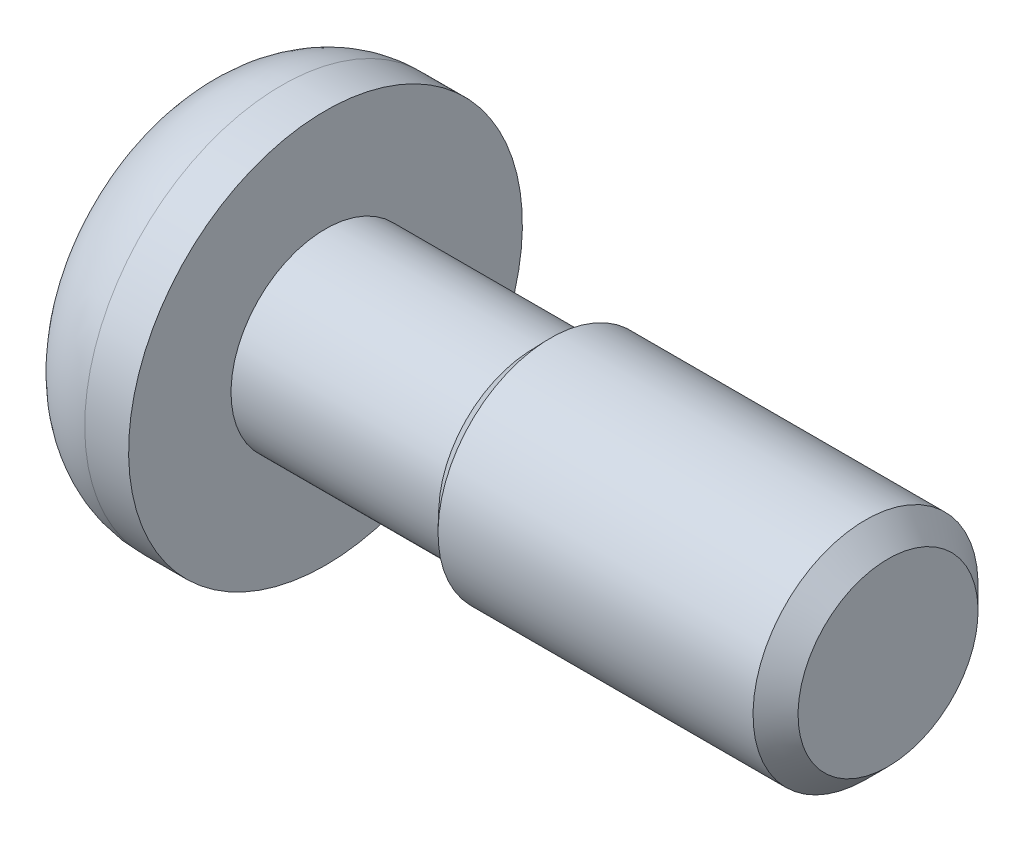
ISO-10303-21;
HEADER;
FILE_DESCRIPTION(('STEP AP214'),'2;1');
FILE_NAME('part.step','',(''),(''),'','','');
FILE_SCHEMA(('AUTOMOTIVE_DESIGN { 1 0 10303 214 1 1 1 1 }'));
ENDSEC;
DATA;
#1=APPLICATION_CONTEXT('core data for automotive mechanical design processes');
#2=APPLICATION_PROTOCOL_DEFINITION('international standard','automotive_design',2000,#1);
#3=PRODUCT_CONTEXT('',#1,'mechanical');
#4=PRODUCT('Part','Part','',(#3));
#5=PRODUCT_RELATED_PRODUCT_CATEGORY('part','',(#4));
#6=PRODUCT_DEFINITION_FORMATION('','',#4);
#7=PRODUCT_DEFINITION_CONTEXT('part definition',#1,'design');
#8=PRODUCT_DEFINITION('design','',#6,#7);
#9=PRODUCT_DEFINITION_SHAPE('','',#8);
#10=(LENGTH_UNIT() NAMED_UNIT(*) SI_UNIT(.MILLI.,.METRE.));
#11=(NAMED_UNIT(*) PLANE_ANGLE_UNIT() SI_UNIT($,.RADIAN.));
#12=(NAMED_UNIT(*) SI_UNIT($,.STERADIAN.) SOLID_ANGLE_UNIT());
#13=UNCERTAINTY_MEASURE_WITH_UNIT(LENGTH_MEASURE(1.E-05),#10,'distance_accuracy_value','');
#14=(GEOMETRIC_REPRESENTATION_CONTEXT(3) GLOBAL_UNCERTAINTY_ASSIGNED_CONTEXT((#13)) GLOBAL_UNIT_ASSIGNED_CONTEXT((#10,
#11,#12)) REPRESENTATION_CONTEXT('',''));
#15=CARTESIAN_POINT('',(0.,0.,0.));
#16=DIRECTION('',(0.,0.,1.));
#17=DIRECTION('',(1.,0.,0.));
#18=AXIS2_PLACEMENT_3D('',#15,#16,#17);
#19=CARTESIAN_POINT('',(-0.8,0.5275,0.325));
#20=DIRECTION('',(1.,0.,0.));
#21=DIRECTION('',(0.,0.,-1.));
#22=AXIS2_PLACEMENT_3D('',#19,#20,#21);
#23=PLANE('',#22);
#24=CARTESIAN_POINT('',(-0.8,0.175726349766277,-0.527499999999999));
#25=DIRECTION('',(0.,1.,0.));
#26=VECTOR('',#25,1.);
#27=LINE('',#24,#26);
#28=CARTESIAN_POINT('',(-0.8,0.175726349760073,-0.5275));
#29=VERTEX_POINT('',#28);
#30=CARTESIAN_POINT('',(-0.8,0.325,-0.5275));
#31=VERTEX_POINT('',#30);
#32=EDGE_CURVE('E480',#29,#31,#27,.T.);
#33=ORIENTED_EDGE('',*,*,#32,.F.);
#34=CARTESIAN_POINT('',(-0.8,0.,0.));
#35=DIRECTION('',(1.,0.,0.));
#36=DIRECTION('',(0.,0.,-1.));
#37=AXIS2_PLACEMENT_3D('',#34,#35,#36);
#38=CIRCLE('',#37,0.556);
#39=CARTESIAN_POINT('',(-0.8,0.325,-0.451121934736055));
#40=VERTEX_POINT('',#39);
#41=EDGE_CURVE('E617',#29,#40,#38,.T.);
#42=ORIENTED_EDGE('',*,*,#41,.T.);
#43=CARTESIAN_POINT('',(-0.8,0.324999999999998,-0.527500000000002));
#44=DIRECTION('',(0.,0.,1.));
#45=VECTOR('',#44,1.);
#46=LINE('',#43,#45);
#47=EDGE_CURVE('E454',#31,#40,#46,.T.);
#48=ORIENTED_EDGE('',*,*,#47,.F.);
#49=EDGE_LOOP('',(#33,#42,#48));
#50=FACE_BOUND('',#49,.T.);
#51=ADVANCED_FACE('F17',(#50),#23,.F.);
#52=CARTESIAN_POINT('',(-0.8,0.451121934736054,-0.325));
#53=DIRECTION('',(0.,1.,0.));
#54=VECTOR('',#53,1.);
#55=LINE('',#52,#54);
#56=CARTESIAN_POINT('',(-0.8,0.451121934736054,-0.325));
#57=VERTEX_POINT('',#56);
#58=CARTESIAN_POINT('',(-0.8,0.5275,-0.325));
#59=VERTEX_POINT('',#58);
#60=EDGE_CURVE('E260',#57,#59,#55,.T.);
#61=ORIENTED_EDGE('',*,*,#60,.F.);
#62=CARTESIAN_POINT('',(-0.8,0.527500000013099,-0.175726349720754));
#63=VERTEX_POINT('',#62);
#64=EDGE_CURVE('E610',#57,#63,#38,.T.);
#65=ORIENTED_EDGE('',*,*,#64,.T.);
#66=CARTESIAN_POINT('',(-0.8,0.5275,-0.325000000000001));
#67=DIRECTION('',(0.,0.,1.));
#68=VECTOR('',#67,1.);
#69=LINE('',#66,#68);
#70=EDGE_CURVE('E605',#59,#63,#69,.T.);
#71=ORIENTED_EDGE('',*,*,#70,.F.);
#72=EDGE_LOOP('',(#61,#65,#71));
#73=FACE_BOUND('',#72,.T.);
#74=ADVANCED_FACE('F174',(#73),#23,.F.);
#75=CARTESIAN_POINT('',(-0.8,0.5275,0.175726349760074));
#76=DIRECTION('',(0.,0.,1.));
#77=VECTOR('',#76,1.);
#78=LINE('',#75,#77);
#79=CARTESIAN_POINT('',(-0.8,0.5275,0.175726349760074));
#80=VERTEX_POINT('',#79);
#81=CARTESIAN_POINT('',(-0.8,0.5275,0.325));
#82=VERTEX_POINT('',#81);
#83=EDGE_CURVE('E600',#80,#82,#78,.T.);
#84=ORIENTED_EDGE('',*,*,#83,.F.);
#85=CARTESIAN_POINT('',(-0.8,0.451121934736054,0.325));
#86=VERTEX_POINT('',#85);
#87=EDGE_CURVE('E620',#80,#86,#38,.T.);
#88=ORIENTED_EDGE('',*,*,#87,.T.);
#89=CARTESIAN_POINT('',(-0.8,0.5275,0.325));
#90=DIRECTION('',(0.,-1.,0.));
#91=VECTOR('',#90,1.);
#92=LINE('',#89,#91);
#93=EDGE_CURVE('E596',#82,#86,#92,.T.);
#94=ORIENTED_EDGE('',*,*,#93,.F.);
#95=EDGE_LOOP('',(#84,#88,#94));
#96=FACE_BOUND('',#95,.T.);
#97=ADVANCED_FACE('F182',(#96),#23,.F.);
#98=CARTESIAN_POINT('',(-0.8,0.325000000000002,0.451121934736053));
#99=DIRECTION('',(0.,0.,1.));
#100=VECTOR('',#99,1.);
#101=LINE('',#98,#100);
#102=CARTESIAN_POINT('',(-0.8,0.325,0.451121934736052));
#103=VERTEX_POINT('',#102);
#104=CARTESIAN_POINT('',(-0.8,0.325,0.5275));
#105=VERTEX_POINT('',#104);
#106=EDGE_CURVE('E682',#103,#105,#101,.T.);
#107=ORIENTED_EDGE('',*,*,#106,.F.);
#108=CARTESIAN_POINT('',(-0.8,0.175726349760077,0.5275));
#109=VERTEX_POINT('',#108);
#110=EDGE_CURVE('E639',#103,#109,#38,.T.);
#111=ORIENTED_EDGE('',*,*,#110,.T.);
#112=CARTESIAN_POINT('',(-0.8,0.324999999999999,0.527499999999998));
#113=DIRECTION('',(0.,-1.,0.));
#114=VECTOR('',#113,1.);
#115=LINE('',#112,#114);
#116=EDGE_CURVE('E419',#105,#109,#115,.T.);
#117=ORIENTED_EDGE('',*,*,#116,.F.);
#118=EDGE_LOOP('',(#107,#111,#117));
#119=FACE_BOUND('',#118,.T.);
#120=ADVANCED_FACE('F712',(#119),#23,.F.);
#121=CARTESIAN_POINT('',(-0.8,-0.175726349766278,0.527499999999999));
#122=DIRECTION('',(0.,-1.,0.));
#123=VECTOR('',#122,1.);
#124=LINE('',#121,#123);
#125=CARTESIAN_POINT('',(-0.8,-0.175726349760073,0.5275));
#126=VERTEX_POINT('',#125);
#127=CARTESIAN_POINT('',(-0.8,-0.325,0.5275));
#128=VERTEX_POINT('',#127);
#129=EDGE_CURVE('E415',#126,#128,#124,.T.);
#130=ORIENTED_EDGE('',*,*,#129,.F.);
#131=CARTESIAN_POINT('',(-0.8,-0.325,0.451121934736055));
#132=VERTEX_POINT('',#131);
#133=EDGE_CURVE('E429',#126,#132,#38,.T.);
#134=ORIENTED_EDGE('',*,*,#133,.T.);
#135=CARTESIAN_POINT('',(-0.8,-0.324999999999998,0.527500000000001));
#136=DIRECTION('',(0.,0.,-1.));
#137=VECTOR('',#136,1.);
#138=LINE('',#135,#137);
#139=EDGE_CURVE('E388',#128,#132,#138,.T.);
#140=ORIENTED_EDGE('',*,*,#139,.F.);
#141=EDGE_LOOP('',(#130,#134,#140));
#142=FACE_BOUND('',#141,.T.);
#143=ADVANCED_FACE('F216',(#142),#23,.F.);
#144=CARTESIAN_POINT('',(-0.8,-0.451121934736053,0.325));
#145=DIRECTION('',(0.,-1.,0.));
#146=VECTOR('',#145,1.);
#147=LINE('',#144,#146);
#148=CARTESIAN_POINT('',(-0.8,-0.451121934736054,0.325));
#149=VERTEX_POINT('',#148);
#150=CARTESIAN_POINT('',(-0.8,-0.5275,0.325));
#151=VERTEX_POINT('',#150);
#152=EDGE_CURVE('E595',#149,#151,#147,.T.);
#153=ORIENTED_EDGE('',*,*,#152,.F.);
#154=CARTESIAN_POINT('',(-0.8,-0.527500000009363,0.17572634973197));
#155=VERTEX_POINT('',#154);
#156=EDGE_CURVE('E650',#149,#155,#38,.T.);
#157=ORIENTED_EDGE('',*,*,#156,.T.);
#158=CARTESIAN_POINT('',(-0.8,-0.5275,0.324999999999999));
#159=DIRECTION('',(0.,0.,-1.));
#160=VECTOR('',#159,1.);
#161=LINE('',#158,#160);
#162=EDGE_CURVE('E229',#151,#155,#161,.T.);
#163=ORIENTED_EDGE('',*,*,#162,.F.);
#164=EDGE_LOOP('',(#153,#157,#163));
#165=FACE_BOUND('',#164,.T.);
#166=ADVANCED_FACE('F207',(#165),#23,.F.);
#167=CARTESIAN_POINT('',(-0.8,-0.5275,-0.175726349760075));
#168=DIRECTION('',(0.,0.,-1.));
#169=VECTOR('',#168,1.);
#170=LINE('',#167,#169);
#171=CARTESIAN_POINT('',(-0.8,-0.5275,-0.175726349760074));
#172=VERTEX_POINT('',#171);
#173=CARTESIAN_POINT('',(-0.8,-0.5275,-0.325));
#174=VERTEX_POINT('',#173);
#175=EDGE_CURVE('E221',#172,#174,#170,.T.);
#176=ORIENTED_EDGE('',*,*,#175,.F.);
#177=CARTESIAN_POINT('',(-0.8,-0.451121934736054,-0.325));
#178=VERTEX_POINT('',#177);
#179=EDGE_CURVE('E223',#172,#178,#38,.T.);
#180=ORIENTED_EDGE('',*,*,#179,.T.);
#181=CARTESIAN_POINT('',(-0.8,-0.5275,-0.325));
#182=DIRECTION('',(0.,1.,0.));
#183=VECTOR('',#182,1.);
#184=LINE('',#181,#183);
#185=EDGE_CURVE('E225',#174,#178,#184,.T.);
#186=ORIENTED_EDGE('',*,*,#185,.F.);
#187=EDGE_LOOP('',(#176,#180,#186));
#188=FACE_BOUND('',#187,.T.);
#189=ADVANCED_FACE('F192',(#188),#23,.F.);
#190=CARTESIAN_POINT('',(5.,0.,0.));
#191=DIRECTION('',(-1.,0.,0.));
#192=DIRECTION('',(0.,1.,0.));
#193=AXIS2_PLACEMENT_3D('',#190,#191,#192);
#194=SPHERICAL_SURFACE('',#193,6.3);
#195=CARTESIAN_POINT('',(-1.21065589915304,0.,0.));
#196=DIRECTION('',(-1.,0.,0.));
#197=DIRECTION('',(0.,-1.,0.));
#198=AXIS2_PLACEMENT_3D('',#195,#196,#197);
#199=CIRCLE('',#198,1.05723852668899);
#200=CARTESIAN_POINT('',(-1.21065589915304,-1.05723852668899,0.));
#201=VERTEX_POINT('',#200);
#202=EDGE_CURVE('E1011',#201,#201,#199,.T.);
#203=ORIENTED_EDGE('',*,*,#202,.T.);
#204=EDGE_LOOP('',(#203));
#205=FACE_BOUND('',#204,.T.);
#206=CARTESIAN_POINT('',(5.,0.325,0.));
#207=DIRECTION('',(0.,-1.,0.));
#208=DIRECTION('',(0.,0.,-1.));
#209=AXIS2_PLACEMENT_3D('',#206,#207,#208);
#210=CIRCLE('',#209,6.29161147878665);
#211=CARTESIAN_POINT('',(-1.27240299853925,0.325,-0.491259222728439));
#212=VERTEX_POINT('',#211);
#213=CARTESIAN_POINT('',(-1.24140299697778,0.325,-0.793261387763704));
#214=VERTEX_POINT('',#213);
#215=EDGE_CURVE('E526',#212,#214,#210,.T.);
#216=ORIENTED_EDGE('',*,*,#215,.F.);
#217=CARTESIAN_POINT('',(-1.27240299853925,0.,0.));
#218=DIRECTION('',(1.,0.,0.));
#219=DIRECTION('',(0.,0.,-1.));
#220=AXIS2_PLACEMENT_3D('',#217,#218,#219);
#221=CIRCLE('',#220,0.589033635640405);
#222=CARTESIAN_POINT('',(-1.27240299853925,0.491259222728444,-0.325));
#223=VERTEX_POINT('',#222);
#224=EDGE_CURVE('E34',#212,#223,#221,.T.);
#225=ORIENTED_EDGE('',*,*,#224,.T.);
#226=CARTESIAN_POINT('',(5.,0.,-0.325));
#227=DIRECTION('',(0.,0.,1.));
#228=DIRECTION('',(1.,0.,0.));
#229=AXIS2_PLACEMENT_3D('',#226,#227,#228);
#230=CIRCLE('',#229,6.29161147878665);
#231=CARTESIAN_POINT('',(-1.24140299697778,0.793261387763704,-0.325));
#232=VERTEX_POINT('',#231);
#233=EDGE_CURVE('E579',#232,#223,#230,.T.);
#234=ORIENTED_EDGE('',*,*,#233,.F.);
#235=CARTESIAN_POINT('',(3.68996658394946,-2.17583404741957,0.));
#236=DIRECTION('',(-0.515807506599209,-0.856704509230521,0.));
#237=DIRECTION('',(0.856704509230521,-0.515807506599209,0.));
#238=AXIS2_PLACEMENT_3D('',#235,#236,#237);
#239=CIRCLE('',#238,5.76537584611105);
#240=CARTESIAN_POINT('',(-1.24140299697778,0.793261387763704,0.325));
#241=VERTEX_POINT('',#240);
#242=EDGE_CURVE('E582',#241,#232,#239,.T.);
#243=ORIENTED_EDGE('',*,*,#242,.F.);
#244=CARTESIAN_POINT('',(5.,0.,0.325));
#245=DIRECTION('',(0.,0.,-1.));
#246=DIRECTION('',(-1.,0.,0.));
#247=AXIS2_PLACEMENT_3D('',#244,#245,#246);
#248=CIRCLE('',#247,6.29161147878665);
#249=CARTESIAN_POINT('',(-1.27240299853925,0.491259222728437,0.325));
#250=VERTEX_POINT('',#249);
#251=EDGE_CURVE('E570',#250,#241,#248,.T.);
#252=ORIENTED_EDGE('',*,*,#251,.F.);
#253=CARTESIAN_POINT('',(-1.27240299853925,0.325,0.491259222728462));
#254=VERTEX_POINT('',#253);
#255=EDGE_CURVE('E663',#250,#254,#221,.T.);
#256=ORIENTED_EDGE('',*,*,#255,.T.);
#257=CARTESIAN_POINT('',(-1.24140299697778,0.325,0.793261387763703));
#258=VERTEX_POINT('',#257);
#259=EDGE_CURVE('E593',#258,#254,#210,.T.);
#260=ORIENTED_EDGE('',*,*,#259,.F.);
#261=CARTESIAN_POINT('',(3.68996658394946,0.,-2.17583404741957));
#262=DIRECTION('',(-0.515807506599209,0.,-0.85670450923052));
#263=DIRECTION('',(-0.85670450923052,0.,0.515807506599209));
#264=AXIS2_PLACEMENT_3D('',#261,#262,#263);
#265=CIRCLE('',#264,5.76537584611105);
#266=CARTESIAN_POINT('',(-1.24140299697778,-0.325,0.793261387763706));
#267=VERTEX_POINT('',#266);
#268=EDGE_CURVE('E583',#267,#258,#265,.T.);
#269=ORIENTED_EDGE('',*,*,#268,.F.);
#270=CARTESIAN_POINT('',(5.,-0.325,0.));
#271=DIRECTION('',(0.,1.,0.));
#272=DIRECTION('',(0.,0.,1.));
#273=AXIS2_PLACEMENT_3D('',#270,#271,#272);
#274=CIRCLE('',#273,6.29161147878665);
#275=CARTESIAN_POINT('',(-1.27240299853925,-0.325,0.491259222728464));
#276=VERTEX_POINT('',#275);
#277=EDGE_CURVE('E523',#276,#267,#274,.T.);
#278=ORIENTED_EDGE('',*,*,#277,.F.);
#279=CARTESIAN_POINT('',(-1.27240299853925,-0.491259222728438,0.325));
#280=VERTEX_POINT('',#279);
#281=EDGE_CURVE('E661',#276,#280,#221,.T.);
#282=ORIENTED_EDGE('',*,*,#281,.T.);
#283=CARTESIAN_POINT('',(-1.24140299697778,-0.793261387763704,0.325));
#284=VERTEX_POINT('',#283);
#285=EDGE_CURVE('E569',#284,#280,#248,.T.);
#286=ORIENTED_EDGE('',*,*,#285,.F.);
#287=CARTESIAN_POINT('',(3.68996658394946,2.17583404741957,0.));
#288=DIRECTION('',(-0.515807506599209,0.85670450923052,0.));
#289=DIRECTION('',(-0.85670450923052,-0.515807506599209,0.));
#290=AXIS2_PLACEMENT_3D('',#287,#288,#289);
#291=CIRCLE('',#290,5.76537584611105);
#292=CARTESIAN_POINT('',(-1.24140299697778,-0.793261387763704,-0.325));
#293=VERTEX_POINT('',#292);
#294=EDGE_CURVE('E562',#293,#284,#291,.T.);
#295=ORIENTED_EDGE('',*,*,#294,.F.);
#296=CARTESIAN_POINT('',(-1.27240299853925,-0.491259222728445,-0.325));
#297=VERTEX_POINT('',#296);
#298=EDGE_CURVE('E42',#297,#293,#230,.T.);
#299=ORIENTED_EDGE('',*,*,#298,.F.);
#300=CARTESIAN_POINT('',(-1.27240299853925,-0.325,-0.491259222728462));
#301=VERTEX_POINT('',#300);
#302=EDGE_CURVE('E594',#297,#301,#221,.T.);
#303=ORIENTED_EDGE('',*,*,#302,.T.);
#304=CARTESIAN_POINT('',(-1.24140299697778,-0.325,-0.793261387763703));
#305=VERTEX_POINT('',#304);
#306=EDGE_CURVE('E525',#305,#301,#274,.T.);
#307=ORIENTED_EDGE('',*,*,#306,.F.);
#308=CARTESIAN_POINT('',(3.68996658394946,0.,2.17583404741957));
#309=DIRECTION('',(-0.515807506599209,0.,0.856704509230521));
#310=DIRECTION('',(0.856704509230521,0.,0.515807506599209));
#311=AXIS2_PLACEMENT_3D('',#308,#309,#310);
#312=CIRCLE('',#311,5.76537584611105);
#313=EDGE_CURVE('E27',#214,#305,#312,.T.);
#314=ORIENTED_EDGE('',*,*,#313,.F.);
#315=EDGE_LOOP('',(#216,#225,#234,#243,#252,#256,#260,#269,#278,#282,#286,#295,#299,#303,#307,#314));
#316=FACE_BOUND('',#315,.T.);
#317=ADVANCED_FACE('F206',(#205,#316),#194,.T.);
#318=CARTESIAN_POINT('',(0.0761245674740481,0.,-0.325));
#319=DIRECTION('',(0.,0.,1.));
#320=DIRECTION('',(1.,0.,0.));
#321=AXIS2_PLACEMENT_3D('',#318,#319,#320);
#322=PLANE('',#321);
#323=CARTESIAN_POINT('',(-1.2834117583287,-0.492181980075875,-0.325));
#324=CARTESIAN_POINT('',(-1.20280169913201,-0.485431133135909,-0.325));
#325=CARTESIAN_POINT('',(-1.12219569008929,-0.478632602854273,-0.325));
#326=CARTESIAN_POINT('',(-0.960991770646235,-0.464940175466196,-0.325));
#327=CARTESIAN_POINT('',(-0.880393860246072,-0.458046278357784,-0.325));
#328=CARTESIAN_POINT('',(-0.799800000000041,-0.451104697905732,-0.325));
#329=B_SPLINE_CURVE_WITH_KNOTS('',3,(#323,#324,#325,#326,#327,#328),.UNSPECIFIED.,.F.,.F.,(4,2,
4),(0.,0.242676612738169,0.485353230490944),.UNSPECIFIED.);
#330=EDGE_CURVE('E664',#297,#178,#329,.T.);
#331=ORIENTED_EDGE('',*,*,#330,.F.);
#332=ORIENTED_EDGE('',*,*,#298,.T.);
#333=DIRECTION('',(0.85670450923052,0.515807506599209,0.));
#334=VECTOR('',#333,1.);
#335=CARTESIAN_POINT('',(-2.,-1.25,-0.325));
#336=LINE('',#335,#334);
#337=EDGE_CURVE('E537',#293,#174,#336,.T.);
#338=ORIENTED_EDGE('',*,*,#337,.T.);
#339=ORIENTED_EDGE('',*,*,#185,.T.);
#340=EDGE_LOOP('',(#331,#332,#338,#339));
#341=FACE_BOUND('',#340,.T.);
#342=ADVANCED_FACE('F214',(#341),#322,.T.);
#343=CARTESIAN_POINT('',(-0.799800000000041,0.451104697905727,-0.325));
#344=CARTESIAN_POINT('',(-0.880393860246072,0.458046278357781,-0.325));
#345=CARTESIAN_POINT('',(-0.960991770646235,0.464940175466195,-0.325));
#346=CARTESIAN_POINT('',(-1.12219569008929,0.478632602854275,-0.325));
#347=CARTESIAN_POINT('',(-1.20280169913201,0.485431133135911,-0.325));
#348=CARTESIAN_POINT('',(-1.2834117583287,0.492181980075879,-0.325));
#349=B_SPLINE_CURVE_WITH_KNOTS('',3,(#343,#344,#345,#346,#347,#348),.UNSPECIFIED.,.F.,.F.,(4,2,
4),(0.,0.242676617752776,0.485353230490945),.UNSPECIFIED.);
#350=EDGE_CURVE('E302',#57,#223,#349,.T.);
#351=ORIENTED_EDGE('',*,*,#350,.F.);
#352=ORIENTED_EDGE('',*,*,#60,.T.);
#353=DIRECTION('',(0.85670450923052,-0.515807506599209,0.));
#354=VECTOR('',#353,1.);
#355=CARTESIAN_POINT('',(-2.,1.25,-0.325));
#356=LINE('',#355,#354);
#357=EDGE_CURVE('E542',#232,#59,#356,.T.);
#358=ORIENTED_EDGE('',*,*,#357,.F.);
#359=ORIENTED_EDGE('',*,*,#233,.T.);
#360=EDGE_LOOP('',(#351,#352,#358,#359));
#361=FACE_BOUND('',#360,.T.);
#362=ADVANCED_FACE('F287',(#361),#322,.T.);
#363=CARTESIAN_POINT('',(0.0761245674740477,0.,0.325));
#364=DIRECTION('',(0.,0.,-1.));
#365=DIRECTION('',(-1.,0.,0.));
#366=AXIS2_PLACEMENT_3D('',#363,#364,#365);
#367=PLANE('',#366);
#368=CARTESIAN_POINT('',(-0.799800000000041,-0.451104697905727,0.325));
#369=CARTESIAN_POINT('',(-0.880393860246072,-0.458046278357781,0.325));
#370=CARTESIAN_POINT('',(-0.960991770646235,-0.464940175466195,0.325));
#371=CARTESIAN_POINT('',(-1.12219569008929,-0.478632602854275,0.325));
#372=CARTESIAN_POINT('',(-1.20280169913201,-0.485431133135912,0.325));
#373=CARTESIAN_POINT('',(-1.2834117583287,-0.492181980075879,0.325));
#374=B_SPLINE_CURVE_WITH_KNOTS('',3,(#368,#369,#370,#371,#372,#373),.UNSPECIFIED.,.F.,.F.,(4,2,
4),(0.,0.242676617752776,0.485353230490945),.UNSPECIFIED.);
#375=EDGE_CURVE('E355',#149,#280,#374,.T.);
#376=ORIENTED_EDGE('',*,*,#375,.F.);
#377=ORIENTED_EDGE('',*,*,#152,.T.);
#378=DIRECTION('',(0.85670450923052,0.515807506599209,0.));
#379=VECTOR('',#378,1.);
#380=CARTESIAN_POINT('',(-2.,-1.25,0.325));
#381=LINE('',#380,#379);
#382=EDGE_CURVE('E532',#284,#151,#381,.T.);
#383=ORIENTED_EDGE('',*,*,#382,.F.);
#384=ORIENTED_EDGE('',*,*,#285,.T.);
#385=EDGE_LOOP('',(#376,#377,#383,#384));
#386=FACE_BOUND('',#385,.T.);
#387=ADVANCED_FACE('F290',(#386),#367,.T.);
#388=CARTESIAN_POINT('',(-1.2834117583287,0.492181980075875,0.325));
#389=CARTESIAN_POINT('',(-1.20280169913201,0.485431133135909,0.325));
#390=CARTESIAN_POINT('',(-1.12219569008929,0.478632602854273,0.325));
#391=CARTESIAN_POINT('',(-0.960991770646235,0.464940175466196,0.325));
#392=CARTESIAN_POINT('',(-0.880393860246072,0.458046278357784,0.325));
#393=CARTESIAN_POINT('',(-0.799800000000041,0.451104697905732,0.325));
#394=B_SPLINE_CURVE_WITH_KNOTS('',3,(#388,#389,#390,#391,#392,#393),.UNSPECIFIED.,.F.,.F.,(4,2,
4),(0.,0.242676612738169,0.485353230490944),.UNSPECIFIED.);
#395=EDGE_CURVE('E666',#250,#86,#394,.T.);
#396=ORIENTED_EDGE('',*,*,#395,.F.);
#397=ORIENTED_EDGE('',*,*,#251,.T.);
#398=DIRECTION('',(0.85670450923052,-0.515807506599209,0.));
#399=VECTOR('',#398,1.);
#400=CARTESIAN_POINT('',(-2.,1.25,0.325));
#401=LINE('',#400,#399);
#402=EDGE_CURVE('E536',#241,#82,#401,.T.);
#403=ORIENTED_EDGE('',*,*,#402,.T.);
#404=ORIENTED_EDGE('',*,*,#93,.T.);
#405=EDGE_LOOP('',(#396,#397,#403,#404));
#406=FACE_BOUND('',#405,.T.);
#407=ADVANCED_FACE('F700',(#406),#367,.T.);
#408=CARTESIAN_POINT('',(-0.39,0.,0.));
#409=DIRECTION('',(-1.,0.,0.));
#410=DIRECTION('',(0.,-1.,0.));
#411=AXIS2_PLACEMENT_3D('',#408,#409,#410);
#412=TOROIDAL_SURFACE('',#411,0.917538461538461,0.832461538461538);
#413=ORIENTED_EDGE('',*,*,#202,.F.);
#414=EDGE_LOOP('',(#413));
#415=FACE_BOUND('',#414,.T.);
#416=CARTESIAN_POINT('',(-0.39,0.,0.));
#417=DIRECTION('',(-1.,0.,0.));
#418=DIRECTION('',(0.,-1.,0.));
#419=AXIS2_PLACEMENT_3D('',#416,#417,#418);
#420=CIRCLE('',#419,1.75);
#421=CARTESIAN_POINT('',(-0.39,-1.75,0.));
#422=VERTEX_POINT('',#421);
#423=EDGE_CURVE('E1013',#422,#422,#420,.T.);
#424=ORIENTED_EDGE('',*,*,#423,.T.);
#425=EDGE_LOOP('',(#424));
#426=FACE_BOUND('',#425,.T.);
#427=ADVANCED_FACE('F706',(#415,#426),#412,.T.);
#428=CARTESIAN_POINT('',(5.,0.,0.));
#429=DIRECTION('',(-1.,0.,0.));
#430=DIRECTION('',(0.,-1.,0.));
#431=AXIS2_PLACEMENT_3D('',#428,#429,#430);
#432=CYLINDRICAL_SURFACE('',#431,1.75);
#433=ORIENTED_EDGE('',*,*,#423,.F.);
#434=EDGE_LOOP('',(#433));
#435=FACE_BOUND('',#434,.T.);
#436=CARTESIAN_POINT('',(0.,0.,0.));
#437=DIRECTION('',(-1.,0.,0.));
#438=DIRECTION('',(0.,-1.,0.));
#439=AXIS2_PLACEMENT_3D('',#436,#437,#438);
#440=CIRCLE('',#439,1.75);
#441=CARTESIAN_POINT('',(0.,-1.75,0.));
#442=VERTEX_POINT('',#441);
#443=EDGE_CURVE('E1018',#442,#442,#440,.T.);
#444=ORIENTED_EDGE('',*,*,#443,.T.);
#445=EDGE_LOOP('',(#444));
#446=FACE_BOUND('',#445,.T.);
#447=ADVANCED_FACE('F833',(#435,#446),#432,.T.);
#448=CARTESIAN_POINT('',(0.,1.75,0.));
#449=DIRECTION('',(-1.,0.,0.));
#450=DIRECTION('',(0.,-1.,0.));
#451=AXIS2_PLACEMENT_3D('',#448,#449,#450);
#452=PLANE('',#451);
#453=ORIENTED_EDGE('',*,*,#443,.F.);
#454=EDGE_LOOP('',(#453));
#455=FACE_BOUND('',#454,.T.);
#456=CARTESIAN_POINT('',(0.,0.,0.));
#457=DIRECTION('',(-1.,0.,0.));
#458=DIRECTION('',(0.,-1.,0.));
#459=AXIS2_PLACEMENT_3D('',#456,#457,#458);
#460=CIRCLE('',#459,0.84);
#461=CARTESIAN_POINT('',(0.,-0.84,0.));
#462=VERTEX_POINT('',#461);
#463=EDGE_CURVE('E1021',#462,#462,#460,.T.);
#464=ORIENTED_EDGE('',*,*,#463,.T.);
#465=EDGE_LOOP('',(#464));
#466=FACE_BOUND('',#465,.T.);
#467=ADVANCED_FACE('F844',(#455,#466),#452,.F.);
#468=CARTESIAN_POINT('',(5.,0.,0.));
#469=DIRECTION('',(-1.,0.,0.));
#470=DIRECTION('',(0.,-1.,0.));
#471=AXIS2_PLACEMENT_3D('',#468,#469,#470);
#472=CYLINDRICAL_SURFACE('',#471,0.84);
#473=ORIENTED_EDGE('',*,*,#463,.F.);
#474=EDGE_LOOP('',(#473));
#475=FACE_BOUND('',#474,.T.);
#476=CARTESIAN_POINT('',(1.84641625,0.,0.));
#477=DIRECTION('',(-1.,0.,0.));
#478=DIRECTION('',(0.,-1.,0.));
#479=AXIS2_PLACEMENT_3D('',#476,#477,#478);
#480=CIRCLE('',#479,0.84);
#481=CARTESIAN_POINT('',(1.84641625,-0.84,0.));
#482=VERTEX_POINT('',#481);
#483=EDGE_CURVE('E1024',#482,#482,#480,.T.);
#484=ORIENTED_EDGE('',*,*,#483,.T.);
#485=EDGE_LOOP('',(#484));
#486=FACE_BOUND('',#485,.T.);
#487=ADVANCED_FACE('F854',(#475,#486),#472,.T.);
#488=CARTESIAN_POINT('',(2.,0.,0.));
#489=DIRECTION('',(1.,0.,0.));
#490=DIRECTION('',(0.,1.,0.));
#491=AXIS2_PLACEMENT_3D('',#488,#489,#490);
#492=CONICAL_SURFACE('',#491,1.,0.805856349856959);
#493=ORIENTED_EDGE('',*,*,#483,.F.);
#494=EDGE_LOOP('',(#493));
#495=FACE_BOUND('',#494,.T.);
#496=CARTESIAN_POINT('',(2.,0.,0.));
#497=DIRECTION('',(-1.,0.,0.));
#498=DIRECTION('',(0.,-1.,0.));
#499=AXIS2_PLACEMENT_3D('',#496,#497,#498);
#500=CIRCLE('',#499,1.);
#501=CARTESIAN_POINT('',(2.,-1.,0.));
#502=VERTEX_POINT('',#501);
#503=EDGE_CURVE('E1026',#502,#502,#500,.T.);
#504=ORIENTED_EDGE('',*,*,#503,.T.);
#505=EDGE_LOOP('',(#504));
#506=FACE_BOUND('',#505,.T.);
#507=ADVANCED_FACE('F864',(#495,#506),#492,.T.);
#508=CARTESIAN_POINT('',(5.,0.,0.));
#509=DIRECTION('',(-1.,0.,0.));
#510=DIRECTION('',(0.,-1.,0.));
#511=AXIS2_PLACEMENT_3D('',#508,#509,#510);
#512=CYLINDRICAL_SURFACE('',#511,1.);
#513=CARTESIAN_POINT('',(4.8,0.,0.));
#514=DIRECTION('',(-1.,0.,0.));
#515=DIRECTION('',(0.,-1.,0.));
#516=AXIS2_PLACEMENT_3D('',#513,#514,#515);
#517=CIRCLE('',#516,1.);
#518=CARTESIAN_POINT('',(4.8,-1.,0.));
#519=VERTEX_POINT('',#518);
#520=EDGE_CURVE('E575',#519,#519,#517,.T.);
#521=ORIENTED_EDGE('',*,*,#520,.T.);
#522=EDGE_LOOP('',(#521));
#523=FACE_BOUND('',#522,.T.);
#524=ORIENTED_EDGE('',*,*,#503,.F.);
#525=EDGE_LOOP('',(#524));
#526=FACE_BOUND('',#525,.T.);
#527=ADVANCED_FACE('F874',(#523,#526),#512,.T.);
#528=CARTESIAN_POINT('',(5.,1.,0.));
#529=DIRECTION('',(-1.,0.,0.));
#530=DIRECTION('',(0.,-1.,0.));
#531=AXIS2_PLACEMENT_3D('',#528,#529,#530);
#532=PLANE('',#531);
#533=CARTESIAN_POINT('',(5.,0.,0.));
#534=DIRECTION('',(-1.,0.,0.));
#535=DIRECTION('',(0.,-1.,0.));
#536=AXIS2_PLACEMENT_3D('',#533,#534,#535);
#537=CIRCLE('',#536,0.8);
#538=CARTESIAN_POINT('',(5.,-0.8,0.));
#539=VERTEX_POINT('',#538);
#540=EDGE_CURVE('E571',#539,#539,#537,.F.);
#541=ORIENTED_EDGE('',*,*,#540,.T.);
#542=EDGE_LOOP('',(#541));
#543=FACE_BOUND('',#542,.T.);
#544=ADVANCED_FACE('F884',(#543),#532,.F.);
#545=CARTESIAN_POINT('',(4.8,0.,0.));
#546=DIRECTION('',(-1.,0.,0.));
#547=DIRECTION('',(0.,-1.,0.));
#548=AXIS2_PLACEMENT_3D('',#545,#546,#547);
#549=CONICAL_SURFACE('',#548,1.,0.785398163397451);
#550=ORIENTED_EDGE('',*,*,#540,.F.);
#551=EDGE_LOOP('',(#550));
#552=FACE_BOUND('',#551,.T.);
#553=ORIENTED_EDGE('',*,*,#520,.F.);
#554=EDGE_LOOP('',(#553));
#555=FACE_BOUND('',#554,.T.);
#556=ADVANCED_FACE('F19',(#552,#555),#549,.T.);
#557=CARTESIAN_POINT('',(-0.8,0.5275,0.325));
#558=DIRECTION('',(-0.515807506599209,-0.856704509230521,0.));
#559=DIRECTION('',(0.856704509230521,-0.515807506599209,0.));
#560=AXIS2_PLACEMENT_3D('',#557,#558,#559);
#561=PLANE('',#560);
#562=CARTESIAN_POINT('',(-0.0206144114170696,0.0582449268740275,0.));
#563=DIRECTION('',(-0.515807506599209,-0.856704509230521,0.));
#564=DIRECTION('',(-0.856704509230521,0.515807506599209,0.));
#565=AXIS2_PLACEMENT_3D('',#562,#563,#564);
#566=ELLIPSE('',#565,0.97226202430077,0.498106242844504);
#567=EDGE_CURVE('E609',#80,#63,#566,.T.);
#568=ORIENTED_EDGE('',*,*,#567,.F.);
#569=ORIENTED_EDGE('',*,*,#83,.T.);
#570=ORIENTED_EDGE('',*,*,#402,.F.);
#571=ORIENTED_EDGE('',*,*,#242,.T.);
#572=ORIENTED_EDGE('',*,*,#357,.T.);
#573=ORIENTED_EDGE('',*,*,#70,.T.);
#574=EDGE_LOOP('',(#568,#569,#570,#571,#572,#573));
#575=FACE_BOUND('',#574,.T.);
#576=ADVANCED_FACE('F202',(#575),#561,.T.);
#577=CARTESIAN_POINT('',(-0.8,-0.5275,-0.325));
#578=DIRECTION('',(-0.515807506599209,0.85670450923052,0.));
#579=DIRECTION('',(-0.85670450923052,-0.515807506599209,0.));
#580=AXIS2_PLACEMENT_3D('',#577,#578,#579);
#581=PLANE('',#580);
#582=CARTESIAN_POINT('',(-0.0206144114170705,-0.0582449268740276,0.));
#583=DIRECTION('',(-0.515807506599209,0.85670450923052,0.));
#584=DIRECTION('',(-0.85670450923052,-0.515807506599209,0.));
#585=AXIS2_PLACEMENT_3D('',#582,#583,#584);
#586=ELLIPSE('',#585,0.972262024300769,0.498106242844504);
#587=EDGE_CURVE('E557',#172,#155,#586,.T.);
#588=ORIENTED_EDGE('',*,*,#587,.F.);
#589=ORIENTED_EDGE('',*,*,#175,.T.);
#590=ORIENTED_EDGE('',*,*,#337,.F.);
#591=ORIENTED_EDGE('',*,*,#294,.T.);
#592=ORIENTED_EDGE('',*,*,#382,.T.);
#593=ORIENTED_EDGE('',*,*,#162,.T.);
#594=EDGE_LOOP('',(#588,#589,#590,#591,#592,#593));
#595=FACE_BOUND('',#594,.T.);
#596=ADVANCED_FACE('F190',(#595),#581,.T.);
#597=CARTESIAN_POINT('',(-0.8,-0.325000000000002,-0.451121934736054));
#598=DIRECTION('',(0.,0.,-1.));
#599=VECTOR('',#598,1.);
#600=LINE('',#597,#599);
#601=CARTESIAN_POINT('',(-0.8,-0.325,-0.451121934736052));
#602=VERTEX_POINT('',#601);
#603=CARTESIAN_POINT('',(-0.8,-0.325,-0.5275));
#604=VERTEX_POINT('',#603);
#605=EDGE_CURVE('E592',#602,#604,#600,.T.);
#606=ORIENTED_EDGE('',*,*,#605,.F.);
#607=CARTESIAN_POINT('',(-0.8,-0.175726349760077,-0.5275));
#608=VERTEX_POINT('',#607);
#609=EDGE_CURVE('E659',#602,#608,#38,.T.);
#610=ORIENTED_EDGE('',*,*,#609,.T.);
#611=CARTESIAN_POINT('',(-0.8,-0.325000000000001,-0.527499999999998));
#612=DIRECTION('',(0.,1.,0.));
#613=VECTOR('',#612,1.);
#614=LINE('',#611,#613);
#615=EDGE_CURVE('E467',#604,#608,#614,.T.);
#616=ORIENTED_EDGE('',*,*,#615,.F.);
#617=EDGE_LOOP('',(#606,#610,#616));
#618=FACE_BOUND('',#617,.T.);
#619=ADVANCED_FACE('F177',(#618),#23,.F.);
#620=CARTESIAN_POINT('',(0.0761245674740481,-0.325,0.));
#621=DIRECTION('',(0.,1.,0.));
#622=DIRECTION('',(1.,0.,0.));
#623=AXIS2_PLACEMENT_3D('',#620,#621,#622);
#624=PLANE('',#623);
#625=CARTESIAN_POINT('',(-1.2834117583287,-0.325,0.492181980075876));
#626=CARTESIAN_POINT('',(-1.20280169913201,-0.324999999999999,0.48543113313591));
#627=CARTESIAN_POINT('',(-1.12219569008929,-0.324999999999999,0.478632602854274));
#628=CARTESIAN_POINT('',(-0.960991770646235,-0.324999999999999,0.464940175466197));
#629=CARTESIAN_POINT('',(-0.880393860246072,-0.324999999999999,0.458046278357785));
#630=CARTESIAN_POINT('',(-0.799800000000041,-0.325,0.451104697905733));
#631=B_SPLINE_CURVE_WITH_KNOTS('',3,(#625,#626,#627,#628,#629,#630),.UNSPECIFIED.,.F.,.F.,(4,2,
4),(0.,0.242676612738169,0.485353230490944),.UNSPECIFIED.);
#632=EDGE_CURVE('E354',#276,#132,#631,.T.);
#633=ORIENTED_EDGE('',*,*,#632,.F.);
#634=ORIENTED_EDGE('',*,*,#277,.T.);
#635=DIRECTION('',(0.85670450923052,0.,-0.515807506599209));
#636=VECTOR('',#635,1.);
#637=CARTESIAN_POINT('',(-2.,-0.324999999999995,1.25));
#638=LINE('',#637,#636);
#639=EDGE_CURVE('E509',#267,#128,#638,.T.);
#640=ORIENTED_EDGE('',*,*,#639,.T.);
#641=ORIENTED_EDGE('',*,*,#139,.T.);
#642=EDGE_LOOP('',(#633,#634,#640,#641));
#643=FACE_BOUND('',#642,.T.);
#644=ADVANCED_FACE('F189',(#643),#624,.T.);
#645=CARTESIAN_POINT('',(0.0761245674740477,0.325,0.));
#646=DIRECTION('',(0.,-1.,0.));
#647=DIRECTION('',(-1.,0.,0.));
#648=AXIS2_PLACEMENT_3D('',#645,#646,#647);
#649=PLANE('',#648);
#650=CARTESIAN_POINT('',(-0.799800000000041,0.325,0.451104697905726));
#651=CARTESIAN_POINT('',(-0.880393860246072,0.325000000000001,0.45804627835778));
#652=CARTESIAN_POINT('',(-0.960991770646235,0.325000000000002,0.464940175466194));
#653=CARTESIAN_POINT('',(-1.12219569008929,0.325000000000002,0.478632602854274));
#654=CARTESIAN_POINT('',(-1.20280169913201,0.325000000000001,0.48543113313591));
#655=CARTESIAN_POINT('',(-1.2834117583287,0.325,0.492181980075878));
#656=B_SPLINE_CURVE_WITH_KNOTS('',3,(#650,#651,#652,#653,#654,#655),.UNSPECIFIED.,.F.,.F.,(4,2,
4),(0.,0.242676617752776,0.485353230490945),.UNSPECIFIED.);
#657=EDGE_CURVE('E423',#103,#254,#656,.T.);
#658=ORIENTED_EDGE('',*,*,#657,.F.);
#659=ORIENTED_EDGE('',*,*,#106,.T.);
#660=DIRECTION('',(0.85670450923052,0.,-0.515807506599209));
#661=VECTOR('',#660,1.);
#662=CARTESIAN_POINT('',(-2.,0.325000000000005,1.25));
#663=LINE('',#662,#661);
#664=EDGE_CURVE('E500',#258,#105,#663,.T.);
#665=ORIENTED_EDGE('',*,*,#664,.F.);
#666=ORIENTED_EDGE('',*,*,#259,.T.);
#667=EDGE_LOOP('',(#658,#659,#665,#666));
#668=FACE_BOUND('',#667,.T.);
#669=ADVANCED_FACE('F198',(#668),#649,.T.);
#670=CARTESIAN_POINT('',(-0.8,-0.325,0.5275));
#671=DIRECTION('',(-0.515807506599209,0.,-0.85670450923052));
#672=DIRECTION('',(-0.85670450923052,0.,0.515807506599209));
#673=AXIS2_PLACEMENT_3D('',#670,#671,#672);
#674=PLANE('',#673);
#675=CARTESIAN_POINT('',(-0.0206144114170705,0.,0.0582449268740276));
#676=DIRECTION('',(-0.515807506599209,0.,-0.85670450923052));
#677=DIRECTION('',(-0.85670450923052,0.,0.515807506599209));
#678=AXIS2_PLACEMENT_3D('',#675,#676,#677);
#679=ELLIPSE('',#678,0.972262024300769,0.498106242844504);
#680=EDGE_CURVE('E412',#126,#109,#679,.T.);
#681=ORIENTED_EDGE('',*,*,#680,.F.);
#682=ORIENTED_EDGE('',*,*,#129,.T.);
#683=ORIENTED_EDGE('',*,*,#639,.F.);
#684=ORIENTED_EDGE('',*,*,#268,.T.);
#685=ORIENTED_EDGE('',*,*,#664,.T.);
#686=ORIENTED_EDGE('',*,*,#116,.T.);
#687=EDGE_LOOP('',(#681,#682,#683,#684,#685,#686));
#688=FACE_BOUND('',#687,.T.);
#689=ADVANCED_FACE('F395',(#688),#674,.T.);
#690=CARTESIAN_POINT('',(-0.8,0.325,-0.5275));
#691=DIRECTION('',(-0.515807506599209,0.,0.856704509230521));
#692=DIRECTION('',(0.856704509230521,0.,0.515807506599209));
#693=AXIS2_PLACEMENT_3D('',#690,#691,#692);
#694=PLANE('',#693);
#695=CARTESIAN_POINT('',(-0.0206144114170696,0.,-0.0582449268740275));
#696=DIRECTION('',(-0.515807506599209,0.,0.856704509230521));
#697=DIRECTION('',(-0.856704509230521,0.,-0.515807506599209));
#698=AXIS2_PLACEMENT_3D('',#695,#696,#697);
#699=ELLIPSE('',#698,0.97226202430077,0.498106242844504);
#700=EDGE_CURVE('E424',#29,#608,#699,.T.);
#701=ORIENTED_EDGE('',*,*,#700,.F.);
#702=ORIENTED_EDGE('',*,*,#32,.T.);
#703=DIRECTION('',(0.85670450923052,0.,0.515807506599209));
#704=VECTOR('',#703,1.);
#705=CARTESIAN_POINT('',(-2.,0.324999999999995,-1.25));
#706=LINE('',#705,#704);
#707=EDGE_CURVE('E508',#214,#31,#706,.T.);
#708=ORIENTED_EDGE('',*,*,#707,.F.);
#709=ORIENTED_EDGE('',*,*,#313,.T.);
#710=DIRECTION('',(0.85670450923052,0.,0.515807506599209));
#711=VECTOR('',#710,1.);
#712=CARTESIAN_POINT('',(-2.,-0.325000000000005,-1.25));
#713=LINE('',#712,#711);
#714=EDGE_CURVE('E522',#305,#604,#713,.T.);
#715=ORIENTED_EDGE('',*,*,#714,.T.);
#716=ORIENTED_EDGE('',*,*,#615,.T.);
#717=EDGE_LOOP('',(#701,#702,#708,#709,#715,#716));
#718=FACE_BOUND('',#717,.T.);
#719=ADVANCED_FACE('F308',(#718),#694,.T.);
#720=CARTESIAN_POINT('',(-0.799800000000041,-0.325,-0.451104697905726));
#721=CARTESIAN_POINT('',(-0.880393860246072,-0.325000000000001,-0.45804627835778));
#722=CARTESIAN_POINT('',(-0.960991770646235,-0.325000000000002,-0.464940175466194));
#723=CARTESIAN_POINT('',(-1.12219569008929,-0.325000000000002,-0.478632602854274));
#724=CARTESIAN_POINT('',(-1.20280169913201,-0.325000000000001,-0.48543113313591));
#725=CARTESIAN_POINT('',(-1.2834117583287,-0.325,-0.492181980075878));
#726=B_SPLINE_CURVE_WITH_KNOTS('',3,(#720,#721,#722,#723,#724,#725),.UNSPECIFIED.,.F.,.F.,(4,2,
4),(0.,0.242676617752776,0.485353230490945),.UNSPECIFIED.);
#727=EDGE_CURVE('E304',#602,#301,#726,.T.);
#728=ORIENTED_EDGE('',*,*,#727,.F.);
#729=ORIENTED_EDGE('',*,*,#605,.T.);
#730=ORIENTED_EDGE('',*,*,#714,.F.);
#731=ORIENTED_EDGE('',*,*,#306,.T.);
#732=EDGE_LOOP('',(#728,#729,#730,#731));
#733=FACE_BOUND('',#732,.T.);
#734=ADVANCED_FACE('F201',(#733),#624,.T.);
#735=CARTESIAN_POINT('',(-1.2834117583287,0.325,-0.492181980075876));
#736=CARTESIAN_POINT('',(-1.20280169913201,0.324999999999999,-0.48543113313591));
#737=CARTESIAN_POINT('',(-1.12219569008929,0.324999999999998,-0.478632602854275));
#738=CARTESIAN_POINT('',(-0.960991770646235,0.324999999999998,-0.464940175466197));
#739=CARTESIAN_POINT('',(-0.880393860246072,0.324999999999999,-0.458046278357785));
#740=CARTESIAN_POINT('',(-0.799800000000041,0.325,-0.451104697905733));
#741=B_SPLINE_CURVE_WITH_KNOTS('',3,(#735,#736,#737,#738,#739,#740),.UNSPECIFIED.,.F.,.F.,(4,2,
4),(0.,0.242676612738169,0.485353230490944),.UNSPECIFIED.);
#742=EDGE_CURVE('E11',#212,#40,#741,.T.);
#743=ORIENTED_EDGE('',*,*,#742,.F.);
#744=ORIENTED_EDGE('',*,*,#215,.T.);
#745=ORIENTED_EDGE('',*,*,#707,.T.);
#746=ORIENTED_EDGE('',*,*,#47,.T.);
#747=EDGE_LOOP('',(#743,#744,#745,#746));
#748=FACE_BOUND('',#747,.T.);
#749=ADVANCED_FACE('F358',(#748),#649,.T.);
#750=CARTESIAN_POINT('',(-0.8,0.,0.));
#751=DIRECTION('',(-1.,0.,0.));
#752=DIRECTION('',(0.,0.,1.));
#753=AXIS2_PLACEMENT_3D('',#750,#751,#752);
#754=CONICAL_SURFACE('',#753,0.556,0.0698131700797733);
#755=ORIENTED_EDGE('',*,*,#567,.T.);
#756=EDGE_CURVE('E615',#63,#80,#38,.T.);
#757=ORIENTED_EDGE('',*,*,#756,.T.);
#758=EDGE_LOOP('',(#755,#757));
#759=FACE_BOUND('',#758,.T.);
#760=ADVANCED_FACE('F171',(#759),#754,.F.);
#761=ORIENTED_EDGE('',*,*,#587,.T.);
#762=EDGE_CURVE('E653',#155,#172,#38,.T.);
#763=ORIENTED_EDGE('',*,*,#762,.T.);
#764=EDGE_LOOP('',(#761,#763));
#765=FACE_BOUND('',#764,.T.);
#766=ADVANCED_FACE('F734',(#765),#754,.F.);
#767=ORIENTED_EDGE('',*,*,#375,.T.);
#768=ORIENTED_EDGE('',*,*,#281,.F.);
#769=ORIENTED_EDGE('',*,*,#632,.T.);
#770=EDGE_CURVE('E647',#132,#149,#38,.T.);
#771=ORIENTED_EDGE('',*,*,#770,.T.);
#772=EDGE_LOOP('',(#767,#768,#769,#771));
#773=FACE_BOUND('',#772,.T.);
#774=ADVANCED_FACE('F696',(#773),#754,.F.);
#775=ORIENTED_EDGE('',*,*,#395,.T.);
#776=EDGE_CURVE('E636',#86,#103,#38,.T.);
#777=ORIENTED_EDGE('',*,*,#776,.T.);
#778=ORIENTED_EDGE('',*,*,#657,.T.);
#779=ORIENTED_EDGE('',*,*,#255,.F.);
#780=EDGE_LOOP('',(#775,#777,#778,#779));
#781=FACE_BOUND('',#780,.T.);
#782=ADVANCED_FACE('F725',(#781),#754,.F.);
#783=ORIENTED_EDGE('',*,*,#680,.T.);
#784=EDGE_CURVE('E642',#109,#126,#38,.T.);
#785=ORIENTED_EDGE('',*,*,#784,.T.);
#786=EDGE_LOOP('',(#783,#785));
#787=FACE_BOUND('',#786,.T.);
#788=ADVANCED_FACE('F720',(#787),#754,.F.);
#789=ORIENTED_EDGE('',*,*,#700,.T.);
#790=EDGE_CURVE('E660',#608,#29,#38,.T.);
#791=ORIENTED_EDGE('',*,*,#790,.T.);
#792=EDGE_LOOP('',(#789,#791));
#793=FACE_BOUND('',#792,.T.);
#794=ADVANCED_FACE('F679',(#793),#754,.F.);
#795=ORIENTED_EDGE('',*,*,#330,.T.);
#796=EDGE_CURVE('E657',#178,#602,#38,.T.);
#797=ORIENTED_EDGE('',*,*,#796,.T.);
#798=ORIENTED_EDGE('',*,*,#727,.T.);
#799=ORIENTED_EDGE('',*,*,#302,.F.);
#800=EDGE_LOOP('',(#795,#797,#798,#799));
#801=FACE_BOUND('',#800,.T.);
#802=ADVANCED_FACE('F169',(#801),#754,.F.);
#803=ORIENTED_EDGE('',*,*,#350,.T.);
#804=ORIENTED_EDGE('',*,*,#224,.F.);
#805=ORIENTED_EDGE('',*,*,#742,.T.);
#806=EDGE_CURVE('E614',#40,#57,#38,.T.);
#807=ORIENTED_EDGE('',*,*,#806,.T.);
#808=EDGE_LOOP('',(#803,#804,#805,#807));
#809=FACE_BOUND('',#808,.T.);
#810=ADVANCED_FACE('F161',(#809),#754,.F.);
#811=CARTESIAN_POINT('',(-0.619344648894503,0.,0.));
#812=DIRECTION('',(-1.,0.,0.));
#813=DIRECTION('',(0.,0.,1.));
#814=AXIS2_PLACEMENT_3D('',#811,#812,#813);
#815=CONICAL_SURFACE('',#814,0.,1.25663706143592);
#816=ORIENTED_EDGE('',*,*,#41,.F.);
#817=ORIENTED_EDGE('',*,*,#790,.F.);
#818=ORIENTED_EDGE('',*,*,#609,.F.);
#819=ORIENTED_EDGE('',*,*,#796,.F.);
#820=ORIENTED_EDGE('',*,*,#179,.F.);
#821=ORIENTED_EDGE('',*,*,#762,.F.);
#822=ORIENTED_EDGE('',*,*,#156,.F.);
#823=ORIENTED_EDGE('',*,*,#770,.F.);
#824=ORIENTED_EDGE('',*,*,#133,.F.);
#825=ORIENTED_EDGE('',*,*,#784,.F.);
#826=ORIENTED_EDGE('',*,*,#110,.F.);
#827=ORIENTED_EDGE('',*,*,#776,.F.);
#828=ORIENTED_EDGE('',*,*,#87,.F.);
#829=ORIENTED_EDGE('',*,*,#756,.F.);
#830=ORIENTED_EDGE('',*,*,#64,.F.);
#831=ORIENTED_EDGE('',*,*,#806,.F.);
#832=EDGE_LOOP('',(#816,#817,#818,#819,#820,#821,#822,#823,#824,#825,#826,#827,#828,#829,#830,#831));
#833=FACE_BOUND('',#832,.T.);
#834=CARTESIAN_POINT('',(-0.619344648894503,0.,0.));
#835=VERTEX_POINT('',#834);
#836=VERTEX_LOOP('',#835);
#837=FACE_BOUND('',#836,.T.);
#838=ADVANCED_FACE('F159',(#833,#837),#815,.F.);
#839=CLOSED_SHELL('',(#51,#74,#97,#120,#143,#166,#189,#317,#342,#362,#387,#407,#427,#447,#467,
#487,#507,#527,#544,#556,#576,#596,#619,#644,#669,#689,#719,#734,#749,#760,#766,#774,#782,#788,
#794,#802,#810,#838));
#840=MANIFOLD_SOLID_BREP('B1',#839);
#841=ADVANCED_BREP_SHAPE_REPRESENTATION('',(#18,#840),#14);
#842=SHAPE_DEFINITION_REPRESENTATION(#9,#841);
ENDSEC;
END-ISO-10303-21;
